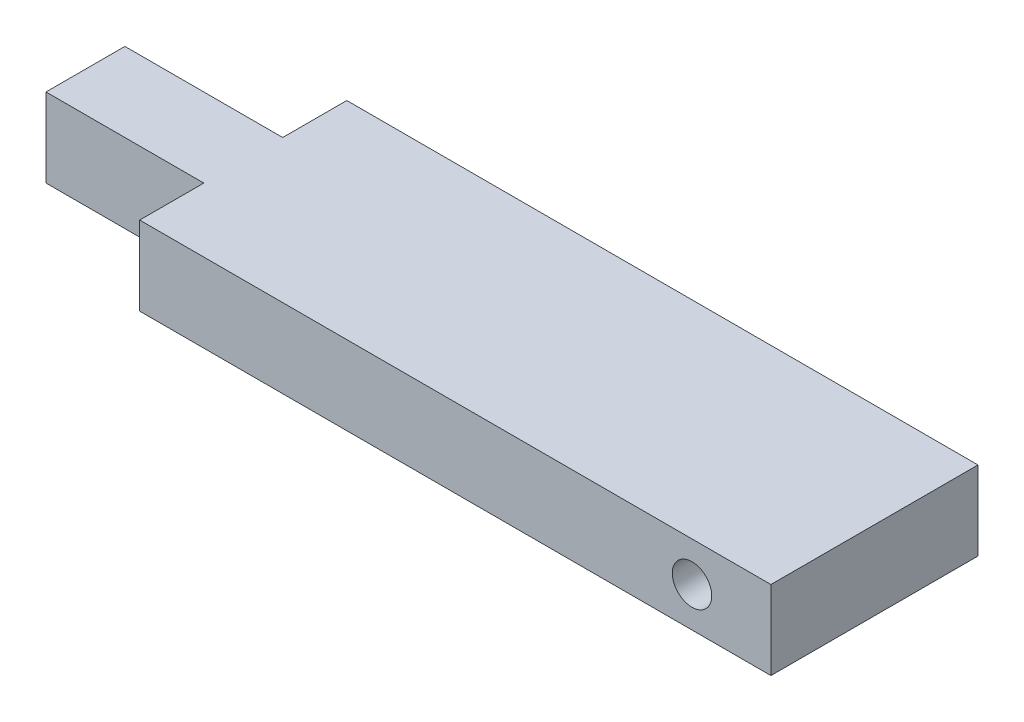
ISO-10303-21;
HEADER;
FILE_DESCRIPTION(('STEP AP214'),'2;1');
FILE_NAME('part.step','',(''),(''),'','','');
FILE_SCHEMA(('AUTOMOTIVE_DESIGN { 1 0 10303 214 1 1 1 1 }'));
ENDSEC;
DATA;
#1=APPLICATION_CONTEXT('core data for automotive mechanical design processes');
#2=APPLICATION_PROTOCOL_DEFINITION('international standard','automotive_design',2000,#1);
#3=PRODUCT_CONTEXT('',#1,'mechanical');
#4=PRODUCT('Part','Part','',(#3));
#5=PRODUCT_RELATED_PRODUCT_CATEGORY('part','',(#4));
#6=PRODUCT_DEFINITION_FORMATION('','',#4);
#7=PRODUCT_DEFINITION_CONTEXT('part definition',#1,'design');
#8=PRODUCT_DEFINITION('design','',#6,#7);
#9=PRODUCT_DEFINITION_SHAPE('','',#8);
#10=(LENGTH_UNIT() NAMED_UNIT(*) SI_UNIT(.MILLI.,.METRE.));
#11=(NAMED_UNIT(*) PLANE_ANGLE_UNIT() SI_UNIT($,.RADIAN.));
#12=(NAMED_UNIT(*) SI_UNIT($,.STERADIAN.) SOLID_ANGLE_UNIT());
#13=UNCERTAINTY_MEASURE_WITH_UNIT(LENGTH_MEASURE(1.E-05),#10,'distance_accuracy_value','');
#14=(GEOMETRIC_REPRESENTATION_CONTEXT(3) GLOBAL_UNCERTAINTY_ASSIGNED_CONTEXT((#13)) GLOBAL_UNIT_ASSIGNED_CONTEXT((#10,
#11,#12)) REPRESENTATION_CONTEXT('',''));
#15=CARTESIAN_POINT('',(0.,0.,0.));
#16=DIRECTION('',(0.,0.,1.));
#17=DIRECTION('',(1.,0.,0.));
#18=AXIS2_PLACEMENT_3D('',#15,#16,#17);
#19=CARTESIAN_POINT('',(0.,12.7,0.));
#20=DIRECTION('',(1.,0.,0.));
#21=DIRECTION('',(0.,0.,-1.));
#22=AXIS2_PLACEMENT_3D('',#19,#20,#21);
#23=PLANE('',#22);
#24=DIRECTION('',(0.,1.,0.));
#25=VECTOR('',#24,1.);
#26=CARTESIAN_POINT('',(0.,0.,-10.3154008438819));
#27=LINE('',#26,#25);
#28=CARTESIAN_POINT('',(0.,0.,-10.3154008438819));
#29=VERTEX_POINT('',#28);
#30=CARTESIAN_POINT('',(0.,12.7,-10.3154008438819));
#31=VERTEX_POINT('',#30);
#32=EDGE_CURVE('E119',#29,#31,#27,.T.);
#33=ORIENTED_EDGE('',*,*,#32,.F.);
#34=DIRECTION('',(0.,0.,1.));
#35=VECTOR('',#34,1.);
#36=CARTESIAN_POINT('',(0.,0.,0.));
#37=LINE('',#36,#35);
#38=CARTESIAN_POINT('',(0.,0.,0.));
#39=VERTEX_POINT('',#38);
#40=EDGE_CURVE('E120',#29,#39,#37,.T.);
#41=ORIENTED_EDGE('',*,*,#40,.T.);
#42=DIRECTION('',(0.,-1.,0.));
#43=VECTOR('',#42,1.);
#44=CARTESIAN_POINT('',(0.,12.7,0.));
#45=LINE('',#44,#43);
#46=CARTESIAN_POINT('',(0.,12.7,0.));
#47=VERTEX_POINT('',#46);
#48=EDGE_CURVE('E11',#47,#39,#45,.T.);
#49=ORIENTED_EDGE('',*,*,#48,.F.);
#50=DIRECTION('',(0.,0.,1.));
#51=VECTOR('',#50,1.);
#52=CARTESIAN_POINT('',(0.,12.7,0.));
#53=LINE('',#52,#51);
#54=EDGE_CURVE('E47',#31,#47,#53,.T.);
#55=ORIENTED_EDGE('',*,*,#54,.F.);
#56=EDGE_LOOP('',(#33,#41,#49,#55));
#57=FACE_BOUND('',#56,.T.);
#58=ADVANCED_FACE('F33',(#57),#23,.F.);
#59=DIRECTION('',(0.,-1.,0.));
#60=VECTOR('',#59,1.);
#61=CARTESIAN_POINT('',(0.,0.,-23.0154008438819));
#62=LINE('',#61,#60);
#63=CARTESIAN_POINT('',(0.,12.7,-23.0154008438819));
#64=VERTEX_POINT('',#63);
#65=CARTESIAN_POINT('',(0.,0.,-23.0154008438819));
#66=VERTEX_POINT('',#65);
#67=EDGE_CURVE('E55',#64,#66,#62,.T.);
#68=ORIENTED_EDGE('',*,*,#67,.F.);
#69=CARTESIAN_POINT('',(0.,12.7,-33.3308016877637));
#70=VERTEX_POINT('',#69);
#71=EDGE_CURVE('E128',#70,#64,#53,.T.);
#72=ORIENTED_EDGE('',*,*,#71,.F.);
#73=DIRECTION('',(0.,-1.,0.));
#74=VECTOR('',#73,1.);
#75=CARTESIAN_POINT('',(0.,12.7,-33.3308016877637));
#76=LINE('',#75,#74);
#77=CARTESIAN_POINT('',(0.,0.,-33.3308016877637));
#78=VERTEX_POINT('',#77);
#79=EDGE_CURVE('E135',#70,#78,#76,.T.);
#80=ORIENTED_EDGE('',*,*,#79,.T.);
#81=EDGE_CURVE('E122',#78,#66,#37,.T.);
#82=ORIENTED_EDGE('',*,*,#81,.T.);
#83=EDGE_LOOP('',(#68,#72,#80,#82));
#84=FACE_BOUND('',#83,.T.);
#85=ADVANCED_FACE('F167',(#84),#23,.F.);
#86=CARTESIAN_POINT('',(0.,12.7,0.));
#87=DIRECTION('',(0.,0.,-1.));
#88=DIRECTION('',(-1.,0.,0.));
#89=AXIS2_PLACEMENT_3D('',#86,#87,#88);
#90=PLANE('',#89);
#91=CARTESIAN_POINT('',(88.9,6.35,0.));
#92=DIRECTION('',(0.,0.,1.));
#93=DIRECTION('',(1.,0.,0.));
#94=AXIS2_PLACEMENT_3D('',#91,#92,#93);
#95=CIRCLE('',#94,3.175);
#96=CARTESIAN_POINT('',(92.075,6.35,0.));
#97=VERTEX_POINT('',#96);
#98=EDGE_CURVE('E269',#97,#97,#95,.T.);
#99=ORIENTED_EDGE('',*,*,#98,.F.);
#100=EDGE_LOOP('',(#99));
#101=FACE_BOUND('',#100,.T.);
#102=DIRECTION('',(1.,0.,0.));
#103=VECTOR('',#102,1.);
#104=CARTESIAN_POINT('',(0.,0.,0.));
#105=LINE('',#104,#103);
#106=CARTESIAN_POINT('',(101.6,0.,0.));
#107=VERTEX_POINT('',#106);
#108=EDGE_CURVE('E137',#39,#107,#105,.T.);
#109=ORIENTED_EDGE('',*,*,#108,.T.);
#110=DIRECTION('',(0.,-1.,0.));
#111=VECTOR('',#110,1.);
#112=CARTESIAN_POINT('',(101.6,12.7,0.));
#113=LINE('',#112,#111);
#114=CARTESIAN_POINT('',(101.6,12.7,0.));
#115=VERTEX_POINT('',#114);
#116=EDGE_CURVE('E40',#115,#107,#113,.T.);
#117=ORIENTED_EDGE('',*,*,#116,.F.);
#118=DIRECTION('',(1.,0.,0.));
#119=VECTOR('',#118,1.);
#120=CARTESIAN_POINT('',(0.,12.7,0.));
#121=LINE('',#120,#119);
#122=EDGE_CURVE('E130',#47,#115,#121,.T.);
#123=ORIENTED_EDGE('',*,*,#122,.F.);
#124=ORIENTED_EDGE('',*,*,#48,.T.);
#125=EDGE_LOOP('',(#109,#117,#123,#124));
#126=FACE_BOUND('',#125,.T.);
#127=ADVANCED_FACE('F178',(#101,#126),#90,.F.);
#128=CARTESIAN_POINT('',(101.6,12.7,0.));
#129=DIRECTION('',(-1.,0.,0.));
#130=DIRECTION('',(0.,0.,1.));
#131=AXIS2_PLACEMENT_3D('',#128,#129,#130);
#132=PLANE('',#131);
#133=DIRECTION('',(0.,0.,-1.));
#134=VECTOR('',#133,1.);
#135=CARTESIAN_POINT('',(101.6,0.,0.));
#136=LINE('',#135,#134);
#137=CARTESIAN_POINT('',(101.6,0.,-33.3308016877637));
#138=VERTEX_POINT('',#137);
#139=EDGE_CURVE('E139',#107,#138,#136,.T.);
#140=ORIENTED_EDGE('',*,*,#139,.T.);
#141=DIRECTION('',(0.,-1.,0.));
#142=VECTOR('',#141,1.);
#143=CARTESIAN_POINT('',(101.6,12.7,-33.3308016877637));
#144=LINE('',#143,#142);
#145=CARTESIAN_POINT('',(101.6,12.7,-33.3308016877637));
#146=VERTEX_POINT('',#145);
#147=EDGE_CURVE('E145',#146,#138,#144,.T.);
#148=ORIENTED_EDGE('',*,*,#147,.F.);
#149=DIRECTION('',(0.,0.,-1.));
#150=VECTOR('',#149,1.);
#151=CARTESIAN_POINT('',(101.6,12.7,0.));
#152=LINE('',#151,#150);
#153=EDGE_CURVE('E132',#115,#146,#152,.T.);
#154=ORIENTED_EDGE('',*,*,#153,.F.);
#155=ORIENTED_EDGE('',*,*,#116,.T.);
#156=EDGE_LOOP('',(#140,#148,#154,#155));
#157=FACE_BOUND('',#156,.T.);
#158=ADVANCED_FACE('F152',(#157),#132,.F.);
#159=CARTESIAN_POINT('',(0.,12.7,-33.3308016877637));
#160=DIRECTION('',(0.,0.,1.));
#161=DIRECTION('',(1.,0.,0.));
#162=AXIS2_PLACEMENT_3D('',#159,#160,#161);
#163=PLANE('',#162);
#164=CARTESIAN_POINT('',(88.9,6.35,-33.3308016877637));
#165=DIRECTION('',(0.,0.,1.));
#166=DIRECTION('',(1.,0.,0.));
#167=AXIS2_PLACEMENT_3D('',#164,#165,#166);
#168=CIRCLE('',#167,3.175);
#169=CARTESIAN_POINT('',(92.075,6.35,-33.3308016877637));
#170=VERTEX_POINT('',#169);
#171=EDGE_CURVE('E176',#170,#170,#168,.T.);
#172=ORIENTED_EDGE('',*,*,#171,.T.);
#173=EDGE_LOOP('',(#172));
#174=FACE_BOUND('',#173,.T.);
#175=DIRECTION('',(-1.,0.,0.));
#176=VECTOR('',#175,1.);
#177=CARTESIAN_POINT('',(0.,0.,-33.3308016877637));
#178=LINE('',#177,#176);
#179=EDGE_CURVE('E141',#138,#78,#178,.T.);
#180=ORIENTED_EDGE('',*,*,#179,.T.);
#181=ORIENTED_EDGE('',*,*,#79,.F.);
#182=DIRECTION('',(-1.,0.,0.));
#183=VECTOR('',#182,1.);
#184=CARTESIAN_POINT('',(0.,12.7,-33.3308016877637));
#185=LINE('',#184,#183);
#186=EDGE_CURVE('E134',#146,#70,#185,.T.);
#187=ORIENTED_EDGE('',*,*,#186,.F.);
#188=ORIENTED_EDGE('',*,*,#147,.T.);
#189=EDGE_LOOP('',(#180,#181,#187,#188));
#190=FACE_BOUND('',#189,.T.);
#191=ADVANCED_FACE('F165',(#174,#190),#163,.F.);
#192=CARTESIAN_POINT('',(0.,12.7,0.));
#193=DIRECTION('',(0.,-1.,0.));
#194=DIRECTION('',(0.,0.,-1.));
#195=AXIS2_PLACEMENT_3D('',#192,#193,#194);
#196=PLANE('',#195);
#197=ORIENTED_EDGE('',*,*,#71,.T.);
#198=DIRECTION('',(1.,0.,0.));
#199=VECTOR('',#198,1.);
#200=CARTESIAN_POINT('',(-25.4,12.7,-23.0154008438819));
#201=LINE('',#200,#199);
#202=CARTESIAN_POINT('',(-25.4,12.7,-23.0154008438819));
#203=VERTEX_POINT('',#202);
#204=EDGE_CURVE('E104',#203,#64,#201,.T.);
#205=ORIENTED_EDGE('',*,*,#204,.F.);
#206=DIRECTION('',(0.,0.,-1.));
#207=VECTOR('',#206,1.);
#208=CARTESIAN_POINT('',(-25.4,12.7,-23.0154008438819));
#209=LINE('',#208,#207);
#210=CARTESIAN_POINT('',(-25.4,12.7,-10.3154008438819));
#211=VERTEX_POINT('',#210);
#212=EDGE_CURVE('E97',#211,#203,#209,.T.);
#213=ORIENTED_EDGE('',*,*,#212,.F.);
#214=DIRECTION('',(1.,0.,0.));
#215=VECTOR('',#214,1.);
#216=CARTESIAN_POINT('',(-25.4,12.7,-10.3154008438819));
#217=LINE('',#216,#215);
#218=EDGE_CURVE('E101',#211,#31,#217,.T.);
#219=ORIENTED_EDGE('',*,*,#218,.T.);
#220=ORIENTED_EDGE('',*,*,#54,.T.);
#221=ORIENTED_EDGE('',*,*,#122,.T.);
#222=ORIENTED_EDGE('',*,*,#153,.T.);
#223=ORIENTED_EDGE('',*,*,#186,.T.);
#224=EDGE_LOOP('',(#197,#205,#213,#219,#220,#221,#222,#223));
#225=FACE_BOUND('',#224,.T.);
#226=ADVANCED_FACE('F99',(#225),#196,.F.);
#227=CARTESIAN_POINT('',(0.,0.,0.));
#228=DIRECTION('',(0.,-1.,0.));
#229=DIRECTION('',(0.,0.,-1.));
#230=AXIS2_PLACEMENT_3D('',#227,#228,#229);
#231=PLANE('',#230);
#232=ORIENTED_EDGE('',*,*,#81,.F.);
#233=ORIENTED_EDGE('',*,*,#179,.F.);
#234=ORIENTED_EDGE('',*,*,#139,.F.);
#235=ORIENTED_EDGE('',*,*,#108,.F.);
#236=ORIENTED_EDGE('',*,*,#40,.F.);
#237=DIRECTION('',(1.,0.,0.));
#238=VECTOR('',#237,1.);
#239=CARTESIAN_POINT('',(-25.4,0.,-10.3154008438819));
#240=LINE('',#239,#238);
#241=CARTESIAN_POINT('',(-25.4,0.,-10.3154008438819));
#242=VERTEX_POINT('',#241);
#243=EDGE_CURVE('E172',#242,#29,#240,.T.);
#244=ORIENTED_EDGE('',*,*,#243,.F.);
#245=DIRECTION('',(0.,0.,1.));
#246=VECTOR('',#245,1.);
#247=CARTESIAN_POINT('',(-25.4,0.,-23.0154008438819));
#248=LINE('',#247,#246);
#249=CARTESIAN_POINT('',(-25.4,0.,-23.0154008438819));
#250=VERTEX_POINT('',#249);
#251=EDGE_CURVE('E113',#250,#242,#248,.T.);
#252=ORIENTED_EDGE('',*,*,#251,.F.);
#253=DIRECTION('',(1.,0.,0.));
#254=VECTOR('',#253,1.);
#255=CARTESIAN_POINT('',(-25.4,0.,-23.0154008438819));
#256=LINE('',#255,#254);
#257=EDGE_CURVE('E124',#250,#66,#256,.T.);
#258=ORIENTED_EDGE('',*,*,#257,.T.);
#259=EDGE_LOOP('',(#232,#233,#234,#235,#236,#244,#252,#258));
#260=FACE_BOUND('',#259,.T.);
#261=ADVANCED_FACE('F160',(#260),#231,.T.);
#262=CARTESIAN_POINT('',(-25.4,0.,-10.3154008438819));
#263=DIRECTION('',(0.,0.,-1.));
#264=DIRECTION('',(0.,1.,0.));
#265=AXIS2_PLACEMENT_3D('',#262,#263,#264);
#266=PLANE('',#265);
#267=ORIENTED_EDGE('',*,*,#32,.T.);
#268=ORIENTED_EDGE('',*,*,#218,.F.);
#269=DIRECTION('',(0.,1.,0.));
#270=VECTOR('',#269,1.);
#271=CARTESIAN_POINT('',(-25.4,0.,-10.3154008438819));
#272=LINE('',#271,#270);
#273=EDGE_CURVE('E108',#242,#211,#272,.T.);
#274=ORIENTED_EDGE('',*,*,#273,.F.);
#275=ORIENTED_EDGE('',*,*,#243,.T.);
#276=EDGE_LOOP('',(#267,#268,#274,#275));
#277=FACE_BOUND('',#276,.T.);
#278=ADVANCED_FACE('F118',(#277),#266,.F.);
#279=CARTESIAN_POINT('',(-25.4,0.,-23.0154008438819));
#280=DIRECTION('',(0.,0.,1.));
#281=DIRECTION('',(1.,0.,0.));
#282=AXIS2_PLACEMENT_3D('',#279,#280,#281);
#283=PLANE('',#282);
#284=ORIENTED_EDGE('',*,*,#67,.T.);
#285=ORIENTED_EDGE('',*,*,#257,.F.);
#286=DIRECTION('',(0.,-1.,0.));
#287=VECTOR('',#286,1.);
#288=CARTESIAN_POINT('',(-25.4,0.,-23.0154008438819));
#289=LINE('',#288,#287);
#290=EDGE_CURVE('E107',#203,#250,#289,.T.);
#291=ORIENTED_EDGE('',*,*,#290,.F.);
#292=ORIENTED_EDGE('',*,*,#204,.T.);
#293=EDGE_LOOP('',(#284,#285,#291,#292));
#294=FACE_BOUND('',#293,.T.);
#295=ADVANCED_FACE('F169',(#294),#283,.F.);
#296=CARTESIAN_POINT('',(-25.4,0.,0.));
#297=DIRECTION('',(1.,0.,0.));
#298=DIRECTION('',(0.,0.,-1.));
#299=AXIS2_PLACEMENT_3D('',#296,#297,#298);
#300=PLANE('',#299);
#301=ORIENTED_EDGE('',*,*,#273,.T.);
#302=ORIENTED_EDGE('',*,*,#212,.T.);
#303=ORIENTED_EDGE('',*,*,#290,.T.);
#304=ORIENTED_EDGE('',*,*,#251,.T.);
#305=EDGE_LOOP('',(#301,#302,#303,#304));
#306=FACE_BOUND('',#305,.T.);
#307=ADVANCED_FACE('F111',(#306),#300,.F.);
#308=CARTESIAN_POINT('',(88.9,6.35,-33.3308016877637));
#309=DIRECTION('',(0.,0.,1.));
#310=DIRECTION('',(1.,0.,0.));
#311=AXIS2_PLACEMENT_3D('',#308,#309,#310);
#312=CYLINDRICAL_SURFACE('',#311,3.175);
#313=ORIENTED_EDGE('',*,*,#171,.F.);
#314=EDGE_LOOP('',(#313));
#315=FACE_BOUND('',#314,.T.);
#316=ORIENTED_EDGE('',*,*,#98,.T.);
#317=EDGE_LOOP('',(#316));
#318=FACE_BOUND('',#317,.T.);
#319=ADVANCED_FACE('F238',(#315,#318),#312,.F.);
#320=CLOSED_SHELL('',(#58,#85,#127,#158,#191,#226,#261,#278,#295,#307,#319));
#321=MANIFOLD_SOLID_BREP('B2',#320);
#322=ADVANCED_BREP_SHAPE_REPRESENTATION('',(#18,#321),#14);
#323=SHAPE_DEFINITION_REPRESENTATION(#9,#322);
ENDSEC;
END-ISO-10303-21;
